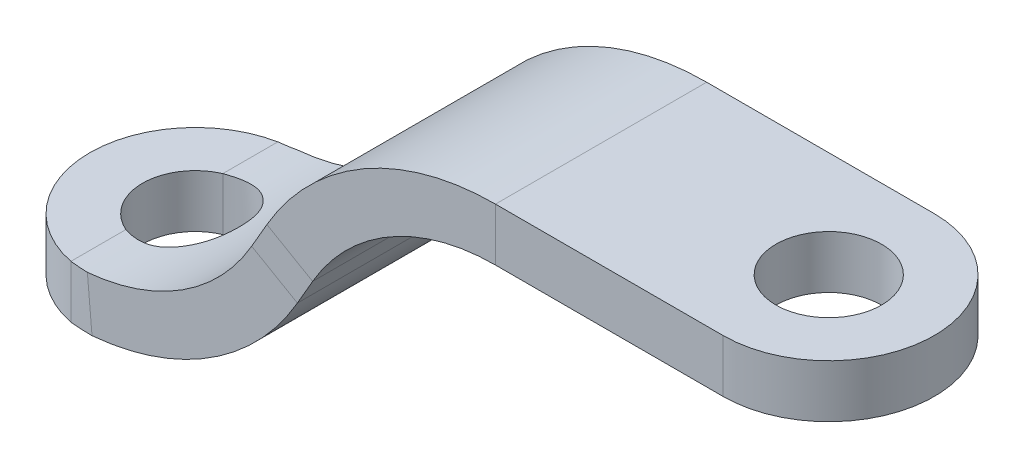
ISO-10303-21;
HEADER;
FILE_DESCRIPTION(('STEP AP214'),'2;1');
FILE_NAME('part.step','',(''),(''),'','','');
FILE_SCHEMA(('AUTOMOTIVE_DESIGN { 1 0 10303 214 1 1 1 1 }'));
ENDSEC;
DATA;
#1=APPLICATION_CONTEXT('core data for automotive mechanical design processes');
#2=APPLICATION_PROTOCOL_DEFINITION('international standard','automotive_design',2000,#1);
#3=PRODUCT_CONTEXT('',#1,'mechanical');
#4=PRODUCT('Part','Part','',(#3));
#5=PRODUCT_RELATED_PRODUCT_CATEGORY('part','',(#4));
#6=PRODUCT_DEFINITION_FORMATION('','',#4);
#7=PRODUCT_DEFINITION_CONTEXT('part definition',#1,'design');
#8=PRODUCT_DEFINITION('design','',#6,#7);
#9=PRODUCT_DEFINITION_SHAPE('','',#8);
#10=(LENGTH_UNIT() NAMED_UNIT(*) SI_UNIT(.MILLI.,.METRE.));
#11=(NAMED_UNIT(*) PLANE_ANGLE_UNIT() SI_UNIT($,.RADIAN.));
#12=(NAMED_UNIT(*) SI_UNIT($,.STERADIAN.) SOLID_ANGLE_UNIT());
#13=UNCERTAINTY_MEASURE_WITH_UNIT(LENGTH_MEASURE(1.E-05),#10,'distance_accuracy_value','');
#14=(GEOMETRIC_REPRESENTATION_CONTEXT(3) GLOBAL_UNCERTAINTY_ASSIGNED_CONTEXT((#13)) GLOBAL_UNIT_ASSIGNED_CONTEXT((#10,
#11,#12)) REPRESENTATION_CONTEXT('',''));
#15=CARTESIAN_POINT('',(0.,0.,0.));
#16=DIRECTION('',(0.,0.,1.));
#17=DIRECTION('',(1.,0.,0.));
#18=AXIS2_PLACEMENT_3D('',#15,#16,#17);
#19=CARTESIAN_POINT('',(6.83867137007164,-11.4396834215958,0.));
#20=DIRECTION('',(-0.86602540378444,0.499999999999998,0.));
#21=DIRECTION('',(0.,0.,1.));
#22=AXIS2_PLACEMENT_3D('',#19,#20,#21);
#23=PLANE('',#22);
#24=DIRECTION('',(0.499999999999998,0.86602540378444,0.));
#25=VECTOR('',#24,1.);
#26=CARTESIAN_POINT('',(6.83867137007164,-11.4396834215958,5.));
#27=LINE('',#26,#25);
#28=CARTESIAN_POINT('',(9.83493649053885,-6.25000000000004,5.));
#29=VERTEX_POINT('',#28);
#30=CARTESIAN_POINT('',(10.5566243270259,-5.00000000000002,5.));
#31=VERTEX_POINT('',#30);
#32=EDGE_CURVE('E83',#29,#31,#27,.T.);
#33=ORIENTED_EDGE('',*,*,#32,.F.);
#34=DIRECTION('',(0.,0.,-1.));
#35=VECTOR('',#34,1.);
#36=CARTESIAN_POINT('',(9.83493649053885,-6.25000000000004,0.));
#37=LINE('',#36,#35);
#38=CARTESIAN_POINT('',(9.83493649053884,-6.25000000000004,-5.));
#39=VERTEX_POINT('',#38);
#40=EDGE_CURVE('E75',#29,#39,#37,.T.);
#41=ORIENTED_EDGE('',*,*,#40,.T.);
#42=DIRECTION('',(0.499999999999998,0.86602540378444,0.));
#43=VECTOR('',#42,1.);
#44=CARTESIAN_POINT('',(6.83867137007164,-11.4396834215958,-5.));
#45=LINE('',#44,#43);
#46=CARTESIAN_POINT('',(10.5566243270259,-5.00000000000002,-5.));
#47=VERTEX_POINT('',#46);
#48=EDGE_CURVE('E91',#39,#47,#45,.T.);
#49=ORIENTED_EDGE('',*,*,#48,.T.);
#50=DIRECTION('',(0.,0.,-1.));
#51=VECTOR('',#50,1.);
#52=CARTESIAN_POINT('',(10.5566243270259,-5.00000000000002,0.));
#53=LINE('',#52,#51);
#54=EDGE_CURVE('E425',#31,#47,#53,.T.);
#55=ORIENTED_EDGE('',*,*,#54,.F.);
#56=EDGE_LOOP('',(#33,#41,#49,#55));
#57=FACE_BOUND('',#56,.T.);
#58=ADVANCED_FACE('F65',(#57),#23,.F.);
#59=CARTESIAN_POINT('',(4.67360786061054,-10.1896834215958,0.));
#60=DIRECTION('',(-0.86602540378444,0.499999999999998,0.));
#61=DIRECTION('',(0.,0.,1.));
#62=AXIS2_PLACEMENT_3D('',#59,#60,#61);
#63=PLANE('',#62);
#64=DIRECTION('',(0.,0.,-1.));
#65=VECTOR('',#64,1.);
#66=CARTESIAN_POINT('',(7.66987298107775,-5.00000000000005,0.));
#67=LINE('',#66,#65);
#68=CARTESIAN_POINT('',(7.66987298107774,-5.00000000000005,5.00000000000003));
#69=VERTEX_POINT('',#68);
#70=CARTESIAN_POINT('',(7.66987298107775,-5.00000000000005,-5.));
#71=VERTEX_POINT('',#70);
#72=EDGE_CURVE('E429',#69,#71,#67,.T.);
#73=ORIENTED_EDGE('',*,*,#72,.F.);
#74=DIRECTION('',(0.499999999999998,0.86602540378444,0.));
#75=VECTOR('',#74,1.);
#76=CARTESIAN_POINT('',(4.67360786061054,-10.1896834215958,5.));
#77=LINE('',#76,#75);
#78=CARTESIAN_POINT('',(8.39156081756478,-3.75000000000003,5.));
#79=VERTEX_POINT('',#78);
#80=EDGE_CURVE('E438',#69,#79,#77,.T.);
#81=ORIENTED_EDGE('',*,*,#80,.T.);
#82=DIRECTION('',(0.,0.,-1.));
#83=VECTOR('',#82,1.);
#84=CARTESIAN_POINT('',(8.39156081756479,-3.75000000000002,0.));
#85=LINE('',#84,#83);
#86=CARTESIAN_POINT('',(8.39156081756479,-3.75000000000002,-5.));
#87=VERTEX_POINT('',#86);
#88=EDGE_CURVE('E418',#79,#87,#85,.T.);
#89=ORIENTED_EDGE('',*,*,#88,.T.);
#90=DIRECTION('',(0.499999999999998,0.86602540378444,0.));
#91=VECTOR('',#90,1.);
#92=CARTESIAN_POINT('',(4.67360786061054,-10.1896834215958,-5.));
#93=LINE('',#92,#91);
#94=EDGE_CURVE('E422',#71,#87,#93,.T.);
#95=ORIENTED_EDGE('',*,*,#94,.F.);
#96=EDGE_LOOP('',(#73,#81,#89,#95));
#97=FACE_BOUND('',#96,.T.);
#98=ADVANCED_FACE('F592',(#97),#63,.T.);
#99=CARTESIAN_POINT('',(4.67360786061054,-10.1896834215958,5.));
#100=DIRECTION('',(0.,0.,1.));
#101=DIRECTION('',(0.499999999999998,0.86602540378444,0.));
#102=AXIS2_PLACEMENT_3D('',#99,#100,#101);
#103=PLANE('',#102);
#104=DIRECTION('',(-0.86602540378444,0.499999999999998,0.));
#105=VECTOR('',#104,1.);
#106=CARTESIAN_POINT('',(7.66987298107775,-5.00000000000005,5.));
#107=LINE('',#106,#105);
#108=EDGE_CURVE('E12',#29,#69,#107,.T.);
#109=ORIENTED_EDGE('',*,*,#108,.F.);
#110=ORIENTED_EDGE('',*,*,#32,.T.);
#111=DIRECTION('',(-0.86602540378444,0.499999999999998,0.));
#112=VECTOR('',#111,1.);
#113=CARTESIAN_POINT('',(8.39156081756479,-3.75000000000002,5.));
#114=LINE('',#113,#112);
#115=EDGE_CURVE('E421',#31,#79,#114,.T.);
#116=ORIENTED_EDGE('',*,*,#115,.T.);
#117=ORIENTED_EDGE('',*,*,#80,.F.);
#118=EDGE_LOOP('',(#109,#110,#116,#117));
#119=FACE_BOUND('',#118,.T.);
#120=ADVANCED_FACE('F589',(#119),#103,.T.);
#121=CARTESIAN_POINT('',(4.67360786061054,-10.1896834215958,-5.));
#122=DIRECTION('',(0.,0.,1.));
#123=DIRECTION('',(0.499999999999998,0.86602540378444,0.));
#124=AXIS2_PLACEMENT_3D('',#121,#122,#123);
#125=PLANE('',#124);
#126=DIRECTION('',(0.86602540378444,-0.499999999999998,0.));
#127=VECTOR('',#126,1.);
#128=CARTESIAN_POINT('',(7.66987298107775,-5.00000000000005,-5.));
#129=LINE('',#128,#127);
#130=EDGE_CURVE('E431',#71,#39,#129,.T.);
#131=ORIENTED_EDGE('',*,*,#130,.F.);
#132=ORIENTED_EDGE('',*,*,#94,.T.);
#133=DIRECTION('',(0.86602540378444,-0.499999999999998,0.));
#134=VECTOR('',#133,1.);
#135=CARTESIAN_POINT('',(8.39156081756479,-3.75000000000002,-5.));
#136=LINE('',#135,#134);
#137=EDGE_CURVE('E427',#87,#47,#136,.T.);
#138=ORIENTED_EDGE('',*,*,#137,.T.);
#139=ORIENTED_EDGE('',*,*,#48,.F.);
#140=EDGE_LOOP('',(#131,#132,#138,#139));
#141=FACE_BOUND('',#140,.T.);
#142=ADVANCED_FACE('F578',(#141),#125,.F.);
#143=CARTESIAN_POINT('',(30.,2.5,0.));
#144=DIRECTION('',(0.,1.,0.));
#145=DIRECTION('',(0.,0.,1.));
#146=AXIS2_PLACEMENT_3D('',#143,#144,#145);
#147=CYLINDRICAL_SURFACE('',#146,2.5);
#148=CARTESIAN_POINT('',(30.,2.5,0.));
#149=DIRECTION('',(0.,1.,0.));
#150=DIRECTION('',(0.,0.,1.));
#151=AXIS2_PLACEMENT_3D('',#148,#149,#150);
#152=CIRCLE('',#151,2.5);
#153=CARTESIAN_POINT('',(30.,2.5,2.5));
#154=VERTEX_POINT('',#153);
#155=EDGE_CURVE('E407',#154,#154,#152,.T.);
#156=ORIENTED_EDGE('',*,*,#155,.T.);
#157=EDGE_LOOP('',(#156));
#158=FACE_BOUND('',#157,.T.);
#159=CARTESIAN_POINT('',(30.,0.,0.));
#160=DIRECTION('',(0.,1.,0.));
#161=DIRECTION('',(0.,0.,1.));
#162=AXIS2_PLACEMENT_3D('',#159,#160,#161);
#163=CIRCLE('',#162,2.5);
#164=CARTESIAN_POINT('',(30.,0.,2.5));
#165=VERTEX_POINT('',#164);
#166=EDGE_CURVE('E388',#165,#165,#163,.T.);
#167=ORIENTED_EDGE('',*,*,#166,.F.);
#168=EDGE_LOOP('',(#167));
#169=FACE_BOUND('',#168,.T.);
#170=ADVANCED_FACE('F615',(#158,#169),#147,.F.);
#171=CARTESIAN_POINT('',(30.,2.5,0.));
#172=DIRECTION('',(0.,1.,0.));
#173=DIRECTION('',(0.,0.,1.));
#174=AXIS2_PLACEMENT_3D('',#171,#172,#173);
#175=CYLINDRICAL_SURFACE('',#174,5.);
#176=CARTESIAN_POINT('',(30.,0.,0.));
#177=DIRECTION('',(0.,1.,0.));
#178=DIRECTION('',(0.,0.,1.));
#179=AXIS2_PLACEMENT_3D('',#176,#177,#178);
#180=CIRCLE('',#179,5.);
#181=CARTESIAN_POINT('',(30.,0.,5.));
#182=VERTEX_POINT('',#181);
#183=CARTESIAN_POINT('',(30.,0.,-5.));
#184=VERTEX_POINT('',#183);
#185=EDGE_CURVE('E404',#182,#184,#180,.T.);
#186=ORIENTED_EDGE('',*,*,#185,.T.);
#187=DIRECTION('',(0.,1.,0.));
#188=VECTOR('',#187,1.);
#189=CARTESIAN_POINT('',(30.,2.5,-5.));
#190=LINE('',#189,#188);
#191=CARTESIAN_POINT('',(30.,2.5,-5.));
#192=VERTEX_POINT('',#191);
#193=EDGE_CURVE('E401',#184,#192,#190,.T.);
#194=ORIENTED_EDGE('',*,*,#193,.T.);
#195=CARTESIAN_POINT('',(30.,2.5,0.));
#196=DIRECTION('',(0.,1.,0.));
#197=DIRECTION('',(0.,0.,1.));
#198=AXIS2_PLACEMENT_3D('',#195,#196,#197);
#199=CIRCLE('',#198,5.);
#200=CARTESIAN_POINT('',(30.,2.5,5.));
#201=VERTEX_POINT('',#200);
#202=EDGE_CURVE('E396',#201,#192,#199,.T.);
#203=ORIENTED_EDGE('',*,*,#202,.F.);
#204=DIRECTION('',(0.,1.,0.));
#205=VECTOR('',#204,1.);
#206=CARTESIAN_POINT('',(30.,2.5,5.));
#207=LINE('',#206,#205);
#208=EDGE_CURVE('E391',#182,#201,#207,.T.);
#209=ORIENTED_EDGE('',*,*,#208,.F.);
#210=EDGE_LOOP('',(#186,#194,#203,#209));
#211=FACE_BOUND('',#210,.T.);
#212=ADVANCED_FACE('F613',(#211),#175,.T.);
#213=CARTESIAN_POINT('',(0.,2.5,0.));
#214=DIRECTION('',(0.,1.,0.));
#215=DIRECTION('',(0.,0.,1.));
#216=AXIS2_PLACEMENT_3D('',#213,#214,#215);
#217=PLANE('',#216);
#218=DIRECTION('',(0.,0.,-1.));
#219=VECTOR('',#218,1.);
#220=CARTESIAN_POINT('',(19.2168783648703,2.5,0.));
#221=LINE('',#220,#219);
#222=CARTESIAN_POINT('',(19.2168783648703,2.5,5.));
#223=VERTEX_POINT('',#222);
#224=CARTESIAN_POINT('',(19.2168783648703,2.5,-5.));
#225=VERTEX_POINT('',#224);
#226=EDGE_CURVE('E375',#223,#225,#221,.T.);
#227=ORIENTED_EDGE('',*,*,#226,.F.);
#228=DIRECTION('',(1.,0.,0.));
#229=VECTOR('',#228,1.);
#230=CARTESIAN_POINT('',(0.,2.5,5.));
#231=LINE('',#230,#229);
#232=EDGE_CURVE('E399',#223,#201,#231,.T.);
#233=ORIENTED_EDGE('',*,*,#232,.T.);
#234=ORIENTED_EDGE('',*,*,#202,.T.);
#235=DIRECTION('',(1.,0.,0.));
#236=VECTOR('',#235,1.);
#237=CARTESIAN_POINT('',(0.,2.5,-5.));
#238=LINE('',#237,#236);
#239=EDGE_CURVE('E381',#225,#192,#238,.T.);
#240=ORIENTED_EDGE('',*,*,#239,.F.);
#241=EDGE_LOOP('',(#227,#233,#234,#240));
#242=FACE_BOUND('',#241,.T.);
#243=ORIENTED_EDGE('',*,*,#155,.F.);
#244=EDGE_LOOP('',(#243));
#245=FACE_BOUND('',#244,.T.);
#246=ADVANCED_FACE('F604',(#242,#245),#217,.T.);
#247=CARTESIAN_POINT('',(0.,2.5,5.));
#248=DIRECTION('',(0.,0.,1.));
#249=DIRECTION('',(1.,0.,0.));
#250=AXIS2_PLACEMENT_3D('',#247,#248,#249);
#251=PLANE('',#250);
#252=DIRECTION('',(0.,1.,0.));
#253=VECTOR('',#252,1.);
#254=CARTESIAN_POINT('',(19.2168783648703,2.5,5.));
#255=LINE('',#254,#253);
#256=CARTESIAN_POINT('',(19.2168783648703,0.,5.));
#257=VERTEX_POINT('',#256);
#258=EDGE_CURVE('E410',#257,#223,#255,.T.);
#259=ORIENTED_EDGE('',*,*,#258,.F.);
#260=DIRECTION('',(1.,0.,0.));
#261=VECTOR('',#260,1.);
#262=CARTESIAN_POINT('',(0.,0.,5.));
#263=LINE('',#262,#261);
#264=EDGE_CURVE('E394',#257,#182,#263,.T.);
#265=ORIENTED_EDGE('',*,*,#264,.T.);
#266=ORIENTED_EDGE('',*,*,#208,.T.);
#267=ORIENTED_EDGE('',*,*,#232,.F.);
#268=EDGE_LOOP('',(#259,#265,#266,#267));
#269=FACE_BOUND('',#268,.T.);
#270=ADVANCED_FACE('F599',(#269),#251,.T.);
#271=CARTESIAN_POINT('',(0.,0.,0.));
#272=DIRECTION('',(0.,1.,0.));
#273=DIRECTION('',(0.,0.,1.));
#274=AXIS2_PLACEMENT_3D('',#271,#272,#273);
#275=PLANE('',#274);
#276=ORIENTED_EDGE('',*,*,#166,.T.);
#277=EDGE_LOOP('',(#276));
#278=FACE_BOUND('',#277,.T.);
#279=ORIENTED_EDGE('',*,*,#264,.F.);
#280=DIRECTION('',(0.,0.,-1.));
#281=VECTOR('',#280,1.);
#282=CARTESIAN_POINT('',(19.2168783648703,0.,0.));
#283=LINE('',#282,#281);
#284=CARTESIAN_POINT('',(19.2168783648703,0.,-5.));
#285=VERTEX_POINT('',#284);
#286=EDGE_CURVE('E385',#257,#285,#283,.T.);
#287=ORIENTED_EDGE('',*,*,#286,.T.);
#288=DIRECTION('',(1.,0.,0.));
#289=VECTOR('',#288,1.);
#290=CARTESIAN_POINT('',(0.,0.,-5.));
#291=LINE('',#290,#289);
#292=EDGE_CURVE('E383',#285,#184,#291,.T.);
#293=ORIENTED_EDGE('',*,*,#292,.T.);
#294=ORIENTED_EDGE('',*,*,#185,.F.);
#295=EDGE_LOOP('',(#279,#287,#293,#294));
#296=FACE_BOUND('',#295,.T.);
#297=ADVANCED_FACE('F611',(#278,#296),#275,.F.);
#298=CARTESIAN_POINT('',(0.,2.5,-5.));
#299=DIRECTION('',(0.,0.,1.));
#300=DIRECTION('',(1.,0.,0.));
#301=AXIS2_PLACEMENT_3D('',#298,#299,#300);
#302=PLANE('',#301);
#303=DIRECTION('',(0.,-1.,0.));
#304=VECTOR('',#303,1.);
#305=CARTESIAN_POINT('',(19.2168783648703,2.5,-5.));
#306=LINE('',#305,#304);
#307=EDGE_CURVE('E413',#225,#285,#306,.T.);
#308=ORIENTED_EDGE('',*,*,#307,.F.);
#309=ORIENTED_EDGE('',*,*,#239,.T.);
#310=ORIENTED_EDGE('',*,*,#193,.F.);
#311=ORIENTED_EDGE('',*,*,#292,.F.);
#312=EDGE_LOOP('',(#308,#309,#310,#311));
#313=FACE_BOUND('',#312,.T.);
#314=ADVANCED_FACE('F608',(#313),#302,.F.);
#315=CARTESIAN_POINT('',(19.2168783648703,-10.,4.99999999999999));
#316=DIRECTION('',(0.,0.,1.));
#317=DIRECTION('',(1.,0.,0.));
#318=AXIS2_PLACEMENT_3D('',#315,#316,#317);
#319=PLANE('',#318);
#320=ORIENTED_EDGE('',*,*,#115,.F.);
#321=CARTESIAN_POINT('',(19.2168783648703,-10.,4.99999999999999));
#322=DIRECTION('',(0.,0.,1.));
#323=DIRECTION('',(1.,0.,0.));
#324=AXIS2_PLACEMENT_3D('',#321,#322,#323);
#325=CIRCLE('',#324,10.);
#326=EDGE_CURVE('E376',#31,#257,#325,.F.);
#327=ORIENTED_EDGE('',*,*,#326,.T.);
#328=ORIENTED_EDGE('',*,*,#258,.T.);
#329=CARTESIAN_POINT('',(19.2168783648703,-10.,4.99999999999999));
#330=DIRECTION('',(0.,0.,-1.));
#331=DIRECTION('',(-1.,0.,0.));
#332=AXIS2_PLACEMENT_3D('',#329,#330,#331);
#333=CIRCLE('',#332,12.5);
#334=EDGE_CURVE('E364',#79,#223,#333,.T.);
#335=ORIENTED_EDGE('',*,*,#334,.F.);
#336=EDGE_LOOP('',(#320,#327,#328,#335));
#337=FACE_BOUND('',#336,.T.);
#338=ADVANCED_FACE('F596',(#337),#319,.T.);
#339=CARTESIAN_POINT('',(19.2168783648703,-10.,-5.));
#340=DIRECTION('',(0.,0.,-1.));
#341=DIRECTION('',(-1.,0.,0.));
#342=AXIS2_PLACEMENT_3D('',#339,#340,#341);
#343=PLANE('',#342);
#344=CARTESIAN_POINT('',(19.2168783648703,-10.,-5.));
#345=DIRECTION('',(0.,0.,1.));
#346=DIRECTION('',(1.,0.,0.));
#347=AXIS2_PLACEMENT_3D('',#344,#345,#346);
#348=CIRCLE('',#347,10.);
#349=EDGE_CURVE('E373',#285,#47,#348,.T.);
#350=ORIENTED_EDGE('',*,*,#349,.T.);
#351=ORIENTED_EDGE('',*,*,#137,.F.);
#352=CARTESIAN_POINT('',(19.2168783648703,-10.,-5.));
#353=DIRECTION('',(0.,0.,1.));
#354=DIRECTION('',(-1.,0.,0.));
#355=AXIS2_PLACEMENT_3D('',#352,#353,#354);
#356=CIRCLE('',#355,12.5);
#357=EDGE_CURVE('E372',#225,#87,#356,.T.);
#358=ORIENTED_EDGE('',*,*,#357,.F.);
#359=ORIENTED_EDGE('',*,*,#307,.T.);
#360=EDGE_LOOP('',(#350,#351,#358,#359));
#361=FACE_BOUND('',#360,.T.);
#362=ADVANCED_FACE('F581',(#361),#343,.T.);
#363=CARTESIAN_POINT('',(19.2168783648703,-10.,-15.653795446802));
#364=DIRECTION('',(0.,0.,1.));
#365=DIRECTION('',(1.,0.,0.));
#366=AXIS2_PLACEMENT_3D('',#363,#364,#365);
#367=CYLINDRICAL_SURFACE('',#366,12.5);
#368=ORIENTED_EDGE('',*,*,#226,.T.);
#369=ORIENTED_EDGE('',*,*,#357,.T.);
#370=ORIENTED_EDGE('',*,*,#88,.F.);
#371=ORIENTED_EDGE('',*,*,#334,.T.);
#372=EDGE_LOOP('',(#368,#369,#370,#371));
#373=FACE_BOUND('',#372,.T.);
#374=ADVANCED_FACE('F595',(#373),#367,.T.);
#375=CARTESIAN_POINT('',(19.2168783648703,-10.,-15.653795446802));
#376=DIRECTION('',(0.,0.,1.));
#377=DIRECTION('',(1.,0.,0.));
#378=AXIS2_PLACEMENT_3D('',#375,#376,#377);
#379=CYLINDRICAL_SURFACE('',#378,10.);
#380=ORIENTED_EDGE('',*,*,#286,.F.);
#381=ORIENTED_EDGE('',*,*,#326,.F.);
#382=ORIENTED_EDGE('',*,*,#54,.T.);
#383=ORIENTED_EDGE('',*,*,#349,.F.);
#384=EDGE_LOOP('',(#380,#381,#382,#383));
#385=FACE_BOUND('',#384,.T.);
#386=ADVANCED_FACE('F291',(#385),#379,.F.);
#387=CARTESIAN_POINT('',(-0.990381056766653,-12.5000000000001,4.90093311139806));
#388=CARTESIAN_POINT('',(-0.623572594484491,-12.5000000000001,4.93395546732923));
#389=CARTESIAN_POINT('',(-0.256766487123015,-12.4838438836446,4.96697764406882));
#390=CARTESIAN_POINT('',(0.108621516963273,-12.4515940081155,5.));
#391=CARTESIAN_POINT('',(-0.990381056766653,-10.0000000000001,4.90093311139806));
#392=CARTESIAN_POINT('',(-0.696934289303198,-10.0000000000001,4.9339554670634));
#393=CARTESIAN_POINT('',(-0.403489398698615,-9.98707510670798,4.96697764433466));
#394=CARTESIAN_POINT('',(-0.111178997782712,-9.96127520649238,5.));
#395=B_SPLINE_SURFACE_WITH_KNOTS('',1,3,((#387,#388,#389,#390),(#391,#392,#393,#394)),
.UNSPECIFIED.,.F.,.F.,.F.,(2,2),(4,4),(0.,1.),(0.,1.),.UNSPECIFIED.);
#396=CARTESIAN_POINT('',(-0.990381056766653,-10.0000000000001,4.90093311139806));
#397=CARTESIAN_POINT('',(-0.990381056766653,-12.5000000000001,4.90093311139806));
#398=B_SPLINE_CURVE_WITH_KNOTS('',1,(#396,#397),.UNSPECIFIED.,.F.,.F.,(2,2),(0.,1.),.UNSPECIFIED.);
#399=CARTESIAN_POINT('',(-0.990381056766651,-12.5000000000001,4.90093311139806));
#400=VERTEX_POINT('',#399);
#401=CARTESIAN_POINT('',(-0.990381056766651,-10.0000000000001,4.90093311139806));
#402=VERTEX_POINT('',#401);
#403=EDGE_CURVE('E194',#400,#402,#398,.F.);
#404=CARTESIAN_POINT('',(-0.990381056766653,-12.5000000000001,4.90093311139806));
#405=CARTESIAN_POINT('',(-0.623572594484491,-12.5000000000001,4.93395546732923));
#406=CARTESIAN_POINT('',(-0.256766487123015,-12.4838438836446,4.96697764406882));
#407=CARTESIAN_POINT('',(0.108621516963273,-12.4515940081155,5.));
#408=B_SPLINE_CURVE_WITH_KNOTS('',3,(#404,#405,#406,#407),.UNSPECIFIED.,.F.,.F.,(4,4),(0.,1.),.UNSPECIFIED.);
#409=CARTESIAN_POINT('',(0.108621516963273,-12.4515940081155,5.));
#410=VERTEX_POINT('',#409);
#411=EDGE_CURVE('E503',#400,#410,#408,.T.);
#412=CARTESIAN_POINT('',(0.108621516963273,-12.4515940081155,5.));
#413=CARTESIAN_POINT('',(-0.111178997782712,-9.96127520649238,5.));
#414=B_SPLINE_CURVE_WITH_KNOTS('',1,(#412,#413),.UNSPECIFIED.,.F.,.F.,(2,2),(0.,1.),.UNSPECIFIED.);
#415=CARTESIAN_POINT('',(-0.111178997782712,-9.96127520649238,5.));
#416=VERTEX_POINT('',#415);
#417=EDGE_CURVE('E325',#410,#416,#414,.T.);
#418=CARTESIAN_POINT('',(-0.111178997782712,-9.96127520649238,5.));
#419=CARTESIAN_POINT('',(-0.403489398698615,-9.98707510670798,4.96697764433466));
#420=CARTESIAN_POINT('',(-0.696934289303198,-10.0000000000001,4.9339554670634));
#421=CARTESIAN_POINT('',(-0.990381056766653,-10.0000000000001,4.90093311139806));
#422=B_SPLINE_CURVE_WITH_KNOTS('',3,(#418,#419,#420,#421),.UNSPECIFIED.,.F.,.F.,(4,4),(0.,1.),.UNSPECIFIED.);
#423=EDGE_CURVE('E271',#402,#416,#422,.F.);
#424=ORIENTED_EDGE('',*,*,#403,.F.);
#425=ORIENTED_EDGE('',*,*,#411,.T.);
#426=ORIENTED_EDGE('',*,*,#417,.T.);
#427=ORIENTED_EDGE('',*,*,#423,.F.);
#428=EDGE_LOOP('',(#424,#425,#426,#427));
#429=FACE_BOUND('',#428,.T.);
#430=ADVANCED_FACE('F278',(#429),#395,.F.);
#431=CARTESIAN_POINT('',(-0.990381056766651,0.,5.));
#432=DIRECTION('',(0.,0.,-1.));
#433=DIRECTION('',(-1.,0.,0.));
#434=AXIS2_PLACEMENT_3D('',#431,#432,#433);
#435=PLANE('',#434);
#436=ORIENTED_EDGE('',*,*,#417,.F.);
#437=CARTESIAN_POINT('',(-0.990381056766651,0.,5.));
#438=DIRECTION('',(0.,0.,1.));
#439=DIRECTION('',(1.,0.,0.));
#440=AXIS2_PLACEMENT_3D('',#437,#438,#439);
#441=CIRCLE('',#440,12.5);
#442=EDGE_CURVE('E557',#410,#29,#441,.T.);
#443=ORIENTED_EDGE('',*,*,#442,.T.);
#444=ORIENTED_EDGE('',*,*,#108,.T.);
#445=CARTESIAN_POINT('',(-0.990381056766651,0.,5.));
#446=DIRECTION('',(0.,0.,1.));
#447=DIRECTION('',(1.,0.,0.));
#448=AXIS2_PLACEMENT_3D('',#445,#446,#447);
#449=CIRCLE('',#448,10.);
#450=EDGE_CURVE('E225',#416,#69,#449,.T.);
#451=ORIENTED_EDGE('',*,*,#450,.F.);
#452=EDGE_LOOP('',(#436,#443,#444,#451));
#453=FACE_BOUND('',#452,.T.);
#454=ADVANCED_FACE('F290',(#453),#435,.F.);
#455=CARTESIAN_POINT('',(-0.990381056766654,0.,-5.));
#456=DIRECTION('',(0.,0.,1.));
#457=DIRECTION('',(0.,-1.,0.));
#458=AXIS2_PLACEMENT_3D('',#455,#456,#457);
#459=PLANE('',#458);
#460=ORIENTED_EDGE('',*,*,#130,.T.);
#461=CARTESIAN_POINT('',(-0.990381056766653,0.,-5.));
#462=DIRECTION('',(0.,0.,1.));
#463=DIRECTION('',(1.,0.,0.));
#464=AXIS2_PLACEMENT_3D('',#461,#462,#463);
#465=CIRCLE('',#464,12.5);
#466=CARTESIAN_POINT('',(0.108621516963286,-12.4515940081155,-5.));
#467=VERTEX_POINT('',#466);
#468=EDGE_CURVE('E236',#39,#467,#465,.F.);
#469=ORIENTED_EDGE('',*,*,#468,.T.);
#470=CARTESIAN_POINT('',(-0.111178997782714,-9.96127520649238,-5.));
#471=CARTESIAN_POINT('',(0.10862151696327,-12.4515940081155,-5.));
#472=B_SPLINE_CURVE_WITH_KNOTS('',1,(#470,#471),.UNSPECIFIED.,.F.,.F.,(2,2),(0.,1.),.UNSPECIFIED.);
#473=CARTESIAN_POINT('',(-0.111178997782702,-9.96127520649237,-5.));
#474=VERTEX_POINT('',#473);
#475=EDGE_CURVE('E537',#467,#474,#472,.F.);
#476=ORIENTED_EDGE('',*,*,#475,.T.);
#477=CARTESIAN_POINT('',(-0.990381056766654,0.,-5.));
#478=DIRECTION('',(0.,0.,-1.));
#479=DIRECTION('',(0.,-1.,0.));
#480=AXIS2_PLACEMENT_3D('',#477,#478,#479);
#481=CIRCLE('',#480,10.);
#482=EDGE_CURVE('E216',#71,#474,#481,.T.);
#483=ORIENTED_EDGE('',*,*,#482,.F.);
#484=EDGE_LOOP('',(#460,#469,#476,#483));
#485=FACE_BOUND('',#484,.T.);
#486=ADVANCED_FACE('F575',(#485),#459,.F.);
#487=CARTESIAN_POINT('',(0.10862151696327,-12.4515940081155,-5.));
#488=CARTESIAN_POINT('',(-0.256766487123018,-12.4838438836446,-4.96697764406882));
#489=CARTESIAN_POINT('',(-0.623572594484493,-12.5000000000001,-4.93395546732923));
#490=CARTESIAN_POINT('',(-0.990381056766656,-12.5000000000001,-4.90093311139806));
#491=CARTESIAN_POINT('',(-0.111178997782714,-9.96127520649238,-5.));
#492=CARTESIAN_POINT('',(-0.403489398698616,-9.98707510670798,-4.96697764433466));
#493=CARTESIAN_POINT('',(-0.696934289303202,-10.0000000000001,-4.9339554670634));
#494=CARTESIAN_POINT('',(-0.990381056766655,-10.0000000000001,-4.90093311139806));
#495=B_SPLINE_SURFACE_WITH_KNOTS('',1,3,((#487,#488,#489,#490),(#491,#492,#493,#494)),
.UNSPECIFIED.,.F.,.F.,.F.,(2,2),(4,4),(0.,1.),(0.,1.),.UNSPECIFIED.);
#496=CARTESIAN_POINT('',(0.10862151696327,-12.4515940081155,-5.));
#497=CARTESIAN_POINT('',(-0.256766487123018,-12.4838438836446,-4.96697764406882));
#498=CARTESIAN_POINT('',(-0.623572594484493,-12.5000000000001,-4.93395546732923));
#499=CARTESIAN_POINT('',(-0.990381056766656,-12.5000000000001,-4.90093311139806));
#500=B_SPLINE_CURVE_WITH_KNOTS('',3,(#496,#497,#498,#499),.UNSPECIFIED.,.F.,.F.,(4,4),(0.,1.),.UNSPECIFIED.);
#501=CARTESIAN_POINT('',(-0.990381056766652,-12.5000000000001,-4.90093311139806));
#502=VERTEX_POINT('',#501);
#503=EDGE_CURVE('E206',#467,#502,#500,.T.);
#504=CARTESIAN_POINT('',(-0.990381056766656,-12.5000000000001,-4.90093311139806));
#505=CARTESIAN_POINT('',(-0.990381056766655,-10.0000000000001,-4.90093311139806));
#506=B_SPLINE_CURVE_WITH_KNOTS('',1,(#504,#505),.UNSPECIFIED.,.F.,.F.,(2,2),(0.,1.),.UNSPECIFIED.);
#507=CARTESIAN_POINT('',(-0.990381056766654,-10.0000000000001,-4.90093311139806));
#508=VERTEX_POINT('',#507);
#509=EDGE_CURVE('E184',#508,#502,#506,.F.);
#510=CARTESIAN_POINT('',(-0.990381056766655,-10.0000000000001,-4.90093311139806));
#511=CARTESIAN_POINT('',(-0.696934289303202,-10.0000000000001,-4.9339554670634));
#512=CARTESIAN_POINT('',(-0.403489398698616,-9.98707510670798,-4.96697764433466));
#513=CARTESIAN_POINT('',(-0.111178997782714,-9.96127520649238,-5.));
#514=B_SPLINE_CURVE_WITH_KNOTS('',3,(#510,#511,#512,#513),.UNSPECIFIED.,.F.,.F.,(4,4),(0.,1.),.UNSPECIFIED.);
#515=EDGE_CURVE('E203',#474,#508,#514,.F.);
#516=ORIENTED_EDGE('',*,*,#475,.F.);
#517=ORIENTED_EDGE('',*,*,#503,.T.);
#518=ORIENTED_EDGE('',*,*,#509,.F.);
#519=ORIENTED_EDGE('',*,*,#515,.F.);
#520=EDGE_LOOP('',(#516,#517,#518,#519));
#521=FACE_BOUND('',#520,.T.);
#522=ADVANCED_FACE('F202',(#521),#495,.F.);
#523=CARTESIAN_POINT('',(-0.990381056766655,-12.5000000000001,-2.29546190610906));
#524=CARTESIAN_POINT('',(-0.45738232059237,-12.5000000000001,-2.44720230755353));
#525=CARTESIAN_POINT('',(0.0351265329849325,-12.4660908116323,-2.50109793761048));
#526=CARTESIAN_POINT('',(0.709675586452521,-12.3859226097604,-2.43529491271343));
#527=CARTESIAN_POINT('',(0.923851906918625,-12.3542835565308,-2.38891278791184));
#528=CARTESIAN_POINT('',(1.22900914307124,-12.301827492266,-2.2826679259556));
#529=CARTESIAN_POINT('',(1.32804595147741,-12.2835068734643,-2.24114102617788));
#530=CARTESIAN_POINT('',(1.4725836894953,-12.2550485875994,-2.16968275782284));
#531=CARTESIAN_POINT('',(1.52009346929625,-12.2453994471913,-2.14433534858975));
#532=CARTESIAN_POINT('',(1.61377634693005,-12.2258191620871,-2.09058455722741));
#533=CARTESIAN_POINT('',(1.65821696398274,-12.2162706616511,-2.0633207014701));
#534=CARTESIAN_POINT('',(2.0833656796094,-12.1223703817202,-1.78368264692674));
#535=CARTESIAN_POINT('',(2.36293222385071,-12.0433688574921,-1.49011141701087));
#536=CARTESIAN_POINT('',(2.73410451997671,-11.9338028550922,-0.812960816535617));
#537=CARTESIAN_POINT('',(2.82591296943812,-11.9031886444639,-0.429362912849224));
#538=CARTESIAN_POINT('',(2.82589060736808,-11.9031958139678,0.427766902659092));
#539=CARTESIAN_POINT('',(2.73420496845522,-11.9337669119108,0.811360988239829));
#540=CARTESIAN_POINT('',(2.4562361309765,-12.015829700979,1.3192958833508));
#541=CARTESIAN_POINT('',(2.3401100962583,-12.0490177223231,1.4773648095111));
#542=CARTESIAN_POINT('',(2.1299417352212,-12.1044965001486,1.69760414043652));
#543=CARTESIAN_POINT('',(2.05388712443694,-12.123925799223,1.76820657435916));
#544=CARTESIAN_POINT('',(1.93070175459186,-12.1539730785956,1.86989421066436));
#545=CARTESIAN_POINT('',(1.88812270764469,-12.1641385542518,1.90308742033629));
#546=CARTESIAN_POINT('',(1.82196523055894,-12.1795410846369,1.95182323119951));
#547=CARTESIAN_POINT('',(1.79953125686968,-12.1847009278459,1.96789283421313));
#548=CARTESIAN_POINT('',(1.75389822886291,-12.1950595989234,1.99968070569215));
#549=CARTESIAN_POINT('',(1.72937186039252,-12.2005517728169,2.01627376669978));
#550=CARTESIAN_POINT('',(0.994946435161293,-12.3628651261361,2.50031145211841));
#551=CARTESIAN_POINT('',(0.0941926031963096,-12.5000000000001,2.58884699125002));
#552=CARTESIAN_POINT('',(-0.990381056766654,-12.5000000000001,2.29546190610906));
#553=CARTESIAN_POINT('',(-0.990381056766655,-10.0000000000001,-2.29546190610906));
#554=CARTESIAN_POINT('',(-0.563985117482973,-10.0000000000001,-2.44720122228832));
#555=CARTESIAN_POINT('',(-0.169974984965385,-9.97287264930587,-2.50109793761048));
#556=CARTESIAN_POINT('',(0.369664257808687,-9.9087380878083,-2.43529491271343));
#557=CARTESIAN_POINT('',(0.541005314181569,-9.88342684522463,-2.38891278791184));
#558=CARTESIAN_POINT('',(0.78513110310366,-9.8414619938128,-2.2826679259556));
#559=CARTESIAN_POINT('',(0.8643605498286,-9.82680549877144,-2.24114102617788));
#560=CARTESIAN_POINT('',(0.979990740242907,-9.80403887007953,-2.16968275782284));
#561=CARTESIAN_POINT('',(1.01799856408367,-9.79631955775304,-2.14433534858975));
#562=CARTESIAN_POINT('',(1.09294486619071,-9.78065532966965,-2.09058455722741));
#563=CARTESIAN_POINT('',(1.12849735983286,-9.77301652932092,-2.0633207014701));
#564=CARTESIAN_POINT('',(1.46861633233419,-9.6978963053762,-1.78368264692674));
#565=CARTESIAN_POINT('',(1.69226956772723,-9.63469508599368,-1.49011141701087));
#566=CARTESIAN_POINT('',(1.98920740462804,-9.54704228407373,-0.812960816535616));
#567=CARTESIAN_POINT('',(2.06265416419717,-9.5225509155711,-0.429362912849224));
#568=CARTESIAN_POINT('',(2.06263627454113,-9.52255665117429,0.427766902659093));
#569=CARTESIAN_POINT('',(1.98928776341085,-9.54701352952863,0.81136098823983));
#570=CARTESIAN_POINT('',(1.76691269342787,-9.61266376078319,1.3192958833508));
#571=CARTESIAN_POINT('',(1.67401186565331,-9.63921417785846,1.4773648095111));
#572=CARTESIAN_POINT('',(1.50587717682363,-9.68359720011892,1.69760414043652));
#573=CARTESIAN_POINT('',(1.44503348819622,-9.6991406393784,1.76820657435916));
#574=CARTESIAN_POINT('',(1.34648519232016,-9.72317846287645,1.86989421066436));
#575=CARTESIAN_POINT('',(1.31242195476242,-9.73131084340143,1.90308742033629));
#576=CARTESIAN_POINT('',(1.25949597309382,-9.74363286770954,1.95182323119951));
#577=CARTESIAN_POINT('',(1.24154879414241,-9.74776074227677,1.96789283421313));
#578=CARTESIAN_POINT('',(1.205042371737,-9.75604767913874,1.99968070569215));
#579=CARTESIAN_POINT('',(1.18542127696069,-9.76044141825352,2.01627376669978));
#580=CARTESIAN_POINT('',(0.597880936775704,-9.89029210090889,2.50031145211841));
#581=CARTESIAN_POINT('',(-0.122761683581168,-10.0000000000001,2.58883361642778));
#582=CARTESIAN_POINT('',(-0.990381056766653,-10.0000000000001,2.29546190610906));
#583=B_SPLINE_SURFACE_WITH_KNOTS('',1,3,((#523,#524,#525,#526,#527,#528,#529,#530,#531,#532,
#533,#534,#535,#536,#537,#538,#539,#540,#541,#542,#543,#544,#545,#546,#547,#548,#549,#550,#551,
#552),(#553,#554,#555,#556,#557,#558,#559,#560,#561,#562,#563,#564,#565,#566,#567,#568,#569,
#570,#571,#572,#573,#574,#575,#576,#577,#578,#579,#580,#581,#582)),.UNSPECIFIED.,.F.,.F.,.F.,(2,
2),(4,2,2,2,2,2,2,2,2,2,2,2,2,2,4),(0.,1.),(0.,0.125,0.1875,0.21875,0.234375,0.25,0.375,0.5,
0.625,0.6875,0.71875,0.734375,0.7421875,0.75,1.),.UNSPECIFIED.);
#584=CARTESIAN_POINT('',(-0.990381056766655,-12.5000000000001,-2.29546190610906));
#585=CARTESIAN_POINT('',(-0.45738232059237,-12.5000000000001,-2.44720230755353));
#586=CARTESIAN_POINT('',(0.0351265329849325,-12.4660908116323,-2.50109793761048));
#587=CARTESIAN_POINT('',(0.709675586452521,-12.3859226097604,-2.43529491271343));
#588=CARTESIAN_POINT('',(0.923851906918625,-12.3542835565308,-2.38891278791184));
#589=CARTESIAN_POINT('',(1.22900914307124,-12.301827492266,-2.2826679259556));
#590=CARTESIAN_POINT('',(1.32804595147741,-12.2835068734643,-2.24114102617788));
#591=CARTESIAN_POINT('',(1.4725836894953,-12.2550485875994,-2.16968275782284));
#592=CARTESIAN_POINT('',(1.52009346929625,-12.2453994471913,-2.14433534858975));
#593=CARTESIAN_POINT('',(1.61377634693005,-12.2258191620871,-2.09058455722741));
#594=CARTESIAN_POINT('',(1.65821696398274,-12.2162706616511,-2.0633207014701));
#595=CARTESIAN_POINT('',(2.0833656796094,-12.1223703817202,-1.78368264692674));
#596=CARTESIAN_POINT('',(2.36293222385071,-12.0433688574921,-1.49011141701087));
#597=CARTESIAN_POINT('',(2.73410451997671,-11.9338028550922,-0.812960816535617));
#598=CARTESIAN_POINT('',(2.82591296943812,-11.9031886444639,-0.429362912849224));
#599=CARTESIAN_POINT('',(2.82589060736808,-11.9031958139678,0.427766902659092));
#600=CARTESIAN_POINT('',(2.73420496845522,-11.9337669119108,0.811360988239829));
#601=CARTESIAN_POINT('',(2.4562361309765,-12.015829700979,1.3192958833508));
#602=CARTESIAN_POINT('',(2.3401100962583,-12.0490177223231,1.4773648095111));
#603=CARTESIAN_POINT('',(2.1299417352212,-12.1044965001486,1.69760414043652));
#604=CARTESIAN_POINT('',(2.05388712443694,-12.123925799223,1.76820657435916));
#605=CARTESIAN_POINT('',(1.93070175459186,-12.1539730785956,1.86989421066436));
#606=CARTESIAN_POINT('',(1.88812270764469,-12.1641385542518,1.90308742033629));
#607=CARTESIAN_POINT('',(1.82196523055894,-12.1795410846369,1.95182323119951));
#608=CARTESIAN_POINT('',(1.79953125686968,-12.1847009278459,1.96789283421313));
#609=CARTESIAN_POINT('',(1.75389822886291,-12.1950595989234,1.99968070569215));
#610=CARTESIAN_POINT('',(1.72937186039252,-12.2005517728169,2.01627376669978));
#611=CARTESIAN_POINT('',(0.994946435161293,-12.3628651261361,2.50031145211841));
#612=CARTESIAN_POINT('',(0.0941926031963096,-12.5000000000001,2.58884699125002));
#613=CARTESIAN_POINT('',(-0.990381056766654,-12.5000000000001,2.29546190610906));
#614=B_SPLINE_CURVE_WITH_KNOTS('',3,(#584,#585,#586,#587,#588,#589,#590,#591,#592,#593,#594,
#595,#596,#597,#598,#599,#600,#601,#602,#603,#604,#605,#606,#607,#608,#609,#610,#611,#612,#613),
.UNSPECIFIED.,.F.,.F.,(4,2,2,2,2,2,2,2,2,2,2,2,2,2,4),(0.,0.125,0.1875,0.21875,0.234375,0.25,
0.375,0.5,0.625,0.6875,0.71875,0.734375,0.7421875,0.75,1.),.UNSPECIFIED.);
#615=CARTESIAN_POINT('',(-0.990381056766651,-12.5000000000001,-2.29546190610906));
#616=VERTEX_POINT('',#615);
#617=CARTESIAN_POINT('',(-0.990381056766652,-12.5000000000001,2.29546190610906));
#618=VERTEX_POINT('',#617);
#619=EDGE_CURVE('E501',#616,#618,#614,.T.);
#620=CARTESIAN_POINT('',(-0.990381056766654,-12.5000000000001,2.29546190610906));
#621=CARTESIAN_POINT('',(-0.990381056766653,-10.0000000000001,2.29546190610906));
#622=B_SPLINE_CURVE_WITH_KNOTS('',1,(#620,#621),.UNSPECIFIED.,.F.,.F.,(2,2),(0.,1.),.UNSPECIFIED.);
#623=CARTESIAN_POINT('',(-0.990381056766654,-10.0000000000001,2.29546190610906));
#624=VERTEX_POINT('',#623);
#625=EDGE_CURVE('E348',#624,#618,#622,.F.);
#626=CARTESIAN_POINT('',(-0.990381056766653,-10.0000000000001,2.29546190610906));
#627=CARTESIAN_POINT('',(-0.122761683581168,-10.0000000000001,2.58883361642778));
#628=CARTESIAN_POINT('',(0.597880936775704,-9.89029210090889,2.50031145211841));
#629=CARTESIAN_POINT('',(1.18542127696069,-9.76044141825352,2.01627376669978));
#630=CARTESIAN_POINT('',(1.205042371737,-9.75604767913874,1.99968070569215));
#631=CARTESIAN_POINT('',(1.24154879414241,-9.74776074227677,1.96789283421313));
#632=CARTESIAN_POINT('',(1.25949597309382,-9.74363286770954,1.95182323119951));
#633=CARTESIAN_POINT('',(1.31242195476242,-9.73131084340143,1.90308742033629));
#634=CARTESIAN_POINT('',(1.34648519232016,-9.72317846287645,1.86989421066436));
#635=CARTESIAN_POINT('',(1.44503348819622,-9.6991406393784,1.76820657435916));
#636=CARTESIAN_POINT('',(1.50587717682363,-9.68359720011892,1.69760414043652));
#637=CARTESIAN_POINT('',(1.67401186565331,-9.63921417785846,1.4773648095111));
#638=CARTESIAN_POINT('',(1.76691269342787,-9.61266376078319,1.3192958833508));
#639=CARTESIAN_POINT('',(1.98928776341085,-9.54701352952863,0.81136098823983));
#640=CARTESIAN_POINT('',(2.06263627454113,-9.52255665117429,0.427766902659093));
#641=CARTESIAN_POINT('',(2.06265416419717,-9.5225509155711,-0.429362912849224));
#642=CARTESIAN_POINT('',(1.98920740462804,-9.54704228407373,-0.812960816535616));
#643=CARTESIAN_POINT('',(1.69226956772723,-9.63469508599368,-1.49011141701087));
#644=CARTESIAN_POINT('',(1.46861633233419,-9.6978963053762,-1.78368264692674));
#645=CARTESIAN_POINT('',(1.12849735983286,-9.77301652932092,-2.0633207014701));
#646=CARTESIAN_POINT('',(1.09294486619071,-9.78065532966965,-2.09058455722741));
#647=CARTESIAN_POINT('',(1.01799856408367,-9.79631955775304,-2.14433534858975));
#648=CARTESIAN_POINT('',(0.979990740242907,-9.80403887007953,-2.16968275782284));
#649=CARTESIAN_POINT('',(0.8643605498286,-9.82680549877144,-2.24114102617788));
#650=CARTESIAN_POINT('',(0.78513110310366,-9.8414619938128,-2.2826679259556));
#651=CARTESIAN_POINT('',(0.541005314181569,-9.88342684522463,-2.38891278791184));
#652=CARTESIAN_POINT('',(0.369664257808687,-9.9087380878083,-2.43529491271343));
#653=CARTESIAN_POINT('',(-0.169974984965385,-9.97287264930587,-2.50109793761048));
#654=CARTESIAN_POINT('',(-0.563985117482973,-10.0000000000001,-2.44720122228832));
#655=CARTESIAN_POINT('',(-0.990381056766655,-10.0000000000001,-2.29546190610906));
#656=B_SPLINE_CURVE_WITH_KNOTS('',3,(#626,#627,#628,#629,#630,#631,#632,#633,#634,#635,#636,
#637,#638,#639,#640,#641,#642,#643,#644,#645,#646,#647,#648,#649,#650,#651,#652,#653,#654,#655),
.UNSPECIFIED.,.F.,.F.,(4,2,2,2,2,2,2,2,2,2,2,2,2,2,4),(0.,0.25,0.2578125,0.265625,0.28125,
0.3125,0.375,0.5,0.625,0.75,0.765625,0.78125,0.8125,0.875,1.),.UNSPECIFIED.);
#657=CARTESIAN_POINT('',(-0.990381056766649,-10.0000000000001,-2.29546190610906));
#658=VERTEX_POINT('',#657);
#659=EDGE_CURVE('E218',#658,#624,#656,.F.);
#660=CARTESIAN_POINT('',(-0.990381056766655,-10.0000000000001,-2.29546190610906));
#661=CARTESIAN_POINT('',(-0.990381056766655,-12.5000000000001,-2.29546190610906));
#662=B_SPLINE_CURVE_WITH_KNOTS('',1,(#660,#661),.UNSPECIFIED.,.F.,.F.,(2,2),(0.,1.),.UNSPECIFIED.);
#663=EDGE_CURVE('E359',#616,#658,#662,.F.);
#664=ORIENTED_EDGE('',*,*,#619,.T.);
#665=ORIENTED_EDGE('',*,*,#625,.F.);
#666=ORIENTED_EDGE('',*,*,#659,.F.);
#667=ORIENTED_EDGE('',*,*,#663,.F.);
#668=EDGE_LOOP('',(#664,#665,#666,#667));
#669=FACE_BOUND('',#668,.T.);
#670=ADVANCED_FACE('F293',(#669),#583,.F.);
#671=CARTESIAN_POINT('',(-0.990381056766657,0.,-17.2062319817387));
#672=DIRECTION('',(0.,0.,1.));
#673=DIRECTION('',(1.,0.,0.));
#674=AXIS2_PLACEMENT_3D('',#671,#672,#673);
#675=CYLINDRICAL_SURFACE('',#674,10.);
#676=DIRECTION('',(0.,0.,-1.));
#677=VECTOR('',#676,1.);
#678=CARTESIAN_POINT('',(-0.990381056766652,-10.0000000000001,0.));
#679=LINE('',#678,#677);
#680=EDGE_CURVE('E173',#658,#508,#679,.T.);
#681=ORIENTED_EDGE('',*,*,#680,.F.);
#682=ORIENTED_EDGE('',*,*,#659,.T.);
#683=DIRECTION('',(0.,0.,-1.));
#684=VECTOR('',#683,1.);
#685=CARTESIAN_POINT('',(-0.990381056766652,-10.0000000000001,0.));
#686=LINE('',#685,#684);
#687=EDGE_CURVE('E185',#402,#624,#686,.T.);
#688=ORIENTED_EDGE('',*,*,#687,.F.);
#689=ORIENTED_EDGE('',*,*,#423,.T.);
#690=ORIENTED_EDGE('',*,*,#450,.T.);
#691=ORIENTED_EDGE('',*,*,#72,.T.);
#692=ORIENTED_EDGE('',*,*,#482,.T.);
#693=ORIENTED_EDGE('',*,*,#515,.T.);
#694=EDGE_LOOP('',(#681,#682,#688,#689,#690,#691,#692,#693));
#695=FACE_BOUND('',#694,.T.);
#696=ADVANCED_FACE('F213',(#695),#675,.F.);
#697=CARTESIAN_POINT('',(-0.990381056766657,0.,-17.2062319817387));
#698=DIRECTION('',(0.,0.,1.));
#699=DIRECTION('',(1.,0.,0.));
#700=AXIS2_PLACEMENT_3D('',#697,#698,#699);
#701=CYLINDRICAL_SURFACE('',#700,12.5);
#702=DIRECTION('',(0.,0.,-1.));
#703=VECTOR('',#702,1.);
#704=CARTESIAN_POINT('',(-0.990381056766652,-12.5000000000001,0.));
#705=LINE('',#704,#703);
#706=EDGE_CURVE('E196',#616,#502,#705,.T.);
#707=ORIENTED_EDGE('',*,*,#706,.T.);
#708=ORIENTED_EDGE('',*,*,#503,.F.);
#709=ORIENTED_EDGE('',*,*,#468,.F.);
#710=ORIENTED_EDGE('',*,*,#40,.F.);
#711=ORIENTED_EDGE('',*,*,#442,.F.);
#712=ORIENTED_EDGE('',*,*,#411,.F.);
#713=DIRECTION('',(0.,0.,-1.));
#714=VECTOR('',#713,1.);
#715=CARTESIAN_POINT('',(-0.990381056766652,-12.5000000000001,0.));
#716=LINE('',#715,#714);
#717=EDGE_CURVE('E456',#400,#618,#716,.T.);
#718=ORIENTED_EDGE('',*,*,#717,.T.);
#719=ORIENTED_EDGE('',*,*,#619,.F.);
#720=EDGE_LOOP('',(#707,#708,#709,#710,#711,#712,#718,#719));
#721=FACE_BOUND('',#720,.T.);
#722=ADVANCED_FACE('F238',(#721),#701,.T.);
#723=CARTESIAN_POINT('',(4.79806115326065,-10.0000000000001,0.));
#724=DIRECTION('',(0.,1.,0.));
#725=DIRECTION('',(0.,0.,1.));
#726=AXIS2_PLACEMENT_3D('',#723,#724,#725);
#727=PLANE('',#726);
#728=CARTESIAN_POINT('',(0.,-10.0000000000001,0.));
#729=DIRECTION('',(0.,1.,0.));
#730=DIRECTION('',(0.,0.,1.));
#731=AXIS2_PLACEMENT_3D('',#728,#729,#730);
#732=CIRCLE('',#731,5.);
#733=EDGE_CURVE('E176',#508,#402,#732,.T.);
#734=ORIENTED_EDGE('',*,*,#733,.T.);
#735=ORIENTED_EDGE('',*,*,#687,.T.);
#736=CARTESIAN_POINT('',(0.,-10.0000000000001,0.));
#737=DIRECTION('',(0.,1.,0.));
#738=DIRECTION('',(0.,0.,1.));
#739=AXIS2_PLACEMENT_3D('',#736,#737,#738);
#740=CIRCLE('',#739,2.5);
#741=EDGE_CURVE('E179',#658,#624,#740,.T.);
#742=ORIENTED_EDGE('',*,*,#741,.F.);
#743=ORIENTED_EDGE('',*,*,#680,.T.);
#744=EDGE_LOOP('',(#734,#735,#742,#743));
#745=FACE_BOUND('',#744,.T.);
#746=ADVANCED_FACE('F175',(#745),#727,.T.);
#747=CARTESIAN_POINT('',(0.,-10.0000000000001,0.));
#748=DIRECTION('',(0.,1.,0.));
#749=DIRECTION('',(0.,0.,1.));
#750=AXIS2_PLACEMENT_3D('',#747,#748,#749);
#751=CYLINDRICAL_SURFACE('',#750,5.);
#752=ORIENTED_EDGE('',*,*,#733,.F.);
#753=ORIENTED_EDGE('',*,*,#509,.T.);
#754=CARTESIAN_POINT('',(0.,-12.5000000000001,0.));
#755=DIRECTION('',(0.,1.,0.));
#756=DIRECTION('',(0.,0.,1.));
#757=AXIS2_PLACEMENT_3D('',#754,#755,#756);
#758=CIRCLE('',#757,5.);
#759=EDGE_CURVE('E208',#502,#400,#758,.T.);
#760=ORIENTED_EDGE('',*,*,#759,.T.);
#761=ORIENTED_EDGE('',*,*,#403,.T.);
#762=EDGE_LOOP('',(#752,#753,#760,#761));
#763=FACE_BOUND('',#762,.T.);
#764=ADVANCED_FACE('F190',(#763),#751,.T.);
#765=CARTESIAN_POINT('',(4.79806115326065,-12.5000000000001,0.));
#766=DIRECTION('',(0.,1.,0.));
#767=DIRECTION('',(0.,0.,1.));
#768=AXIS2_PLACEMENT_3D('',#765,#766,#767);
#769=PLANE('',#768);
#770=ORIENTED_EDGE('',*,*,#717,.F.);
#771=ORIENTED_EDGE('',*,*,#759,.F.);
#772=ORIENTED_EDGE('',*,*,#706,.F.);
#773=CARTESIAN_POINT('',(0.,-12.5000000000001,0.));
#774=DIRECTION('',(0.,1.,0.));
#775=DIRECTION('',(0.,0.,1.));
#776=AXIS2_PLACEMENT_3D('',#773,#774,#775);
#777=CIRCLE('',#776,2.5);
#778=EDGE_CURVE('E491',#616,#618,#777,.T.);
#779=ORIENTED_EDGE('',*,*,#778,.T.);
#780=EDGE_LOOP('',(#770,#771,#772,#779));
#781=FACE_BOUND('',#780,.T.);
#782=ADVANCED_FACE('F467',(#781),#769,.F.);
#783=CARTESIAN_POINT('',(0.,-10.0000000000001,0.));
#784=DIRECTION('',(0.,1.,0.));
#785=DIRECTION('',(0.,0.,1.));
#786=AXIS2_PLACEMENT_3D('',#783,#784,#785);
#787=CYLINDRICAL_SURFACE('',#786,2.5);
#788=ORIENTED_EDGE('',*,*,#778,.F.);
#789=ORIENTED_EDGE('',*,*,#663,.T.);
#790=ORIENTED_EDGE('',*,*,#741,.T.);
#791=ORIENTED_EDGE('',*,*,#625,.T.);
#792=EDGE_LOOP('',(#788,#789,#790,#791));
#793=FACE_BOUND('',#792,.T.);
#794=ADVANCED_FACE('F458',(#793),#787,.F.);
#795=CLOSED_SHELL('',(#58,#98,#120,#142,#170,#212,#246,#270,#297,#314,#338,#362,#374,#386,#430,
#454,#486,#522,#670,#696,#722,#746,#764,#782,#794));
#796=MANIFOLD_SOLID_BREP('B2',#795);
#797=ADVANCED_BREP_SHAPE_REPRESENTATION('',(#18,#796),#14);
#798=SHAPE_DEFINITION_REPRESENTATION(#9,#797);
ENDSEC;
END-ISO-10303-21;
